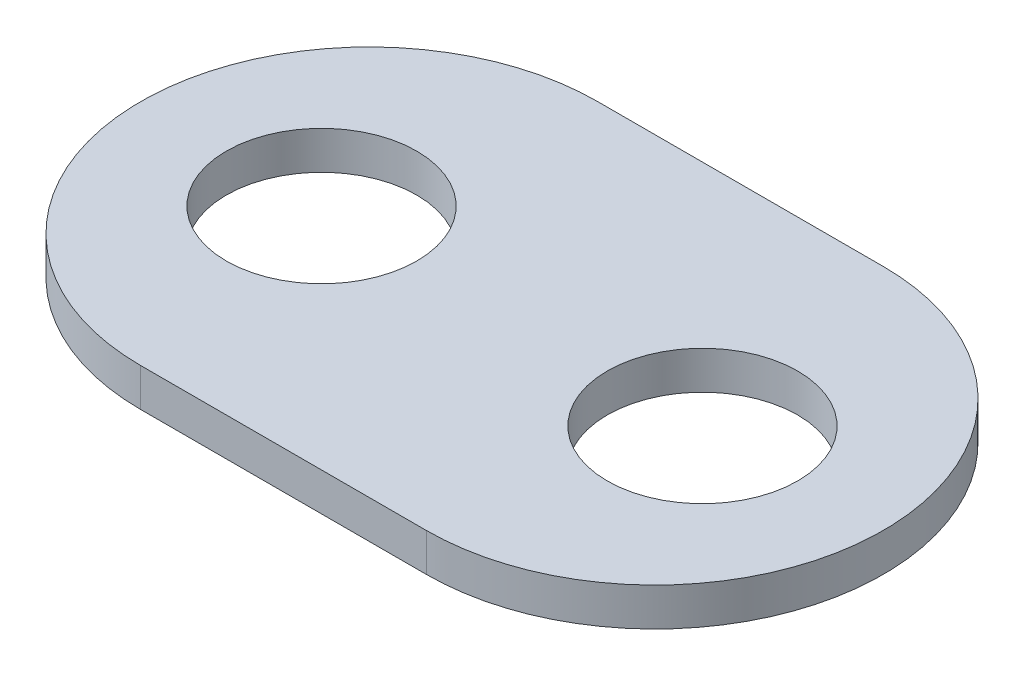
ISO-10303-21;
HEADER;
FILE_DESCRIPTION(('STEP AP214'),'2;1');
FILE_NAME('part.step','',(''),(''),'','','');
FILE_SCHEMA(('AUTOMOTIVE_DESIGN { 1 0 10303 214 1 1 1 1 }'));
ENDSEC;
DATA;
#1=APPLICATION_CONTEXT('core data for automotive mechanical design processes');
#2=APPLICATION_PROTOCOL_DEFINITION('international standard','automotive_design',2000,#1);
#3=PRODUCT_CONTEXT('',#1,'mechanical');
#4=PRODUCT('Part','Part','',(#3));
#5=PRODUCT_RELATED_PRODUCT_CATEGORY('part','',(#4));
#6=PRODUCT_DEFINITION_FORMATION('','',#4);
#7=PRODUCT_DEFINITION_CONTEXT('part definition',#1,'design');
#8=PRODUCT_DEFINITION('design','',#6,#7);
#9=PRODUCT_DEFINITION_SHAPE('','',#8);
#10=(LENGTH_UNIT() NAMED_UNIT(*) SI_UNIT(.MILLI.,.METRE.));
#11=(NAMED_UNIT(*) PLANE_ANGLE_UNIT() SI_UNIT($,.RADIAN.));
#12=(NAMED_UNIT(*) SI_UNIT($,.STERADIAN.) SOLID_ANGLE_UNIT());
#13=UNCERTAINTY_MEASURE_WITH_UNIT(LENGTH_MEASURE(1.E-05),#10,'distance_accuracy_value','');
#14=(GEOMETRIC_REPRESENTATION_CONTEXT(3) GLOBAL_UNCERTAINTY_ASSIGNED_CONTEXT((#13)) GLOBAL_UNIT_ASSIGNED_CONTEXT((#10,
#11,#12)) REPRESENTATION_CONTEXT('',''));
#15=CARTESIAN_POINT('',(0.,0.,0.));
#16=DIRECTION('',(0.,0.,1.));
#17=DIRECTION('',(1.,0.,0.));
#18=AXIS2_PLACEMENT_3D('',#15,#16,#17);
#19=CARTESIAN_POINT('',(7.5,2.,0.));
#20=DIRECTION('',(0.,-1.,0.));
#21=DIRECTION('',(0.,0.,-1.));
#22=AXIS2_PLACEMENT_3D('',#19,#20,#21);
#23=CYLINDRICAL_SURFACE('',#22,12.);
#24=CARTESIAN_POINT('',(7.5,0.,0.));
#25=DIRECTION('',(0.,1.,0.));
#26=DIRECTION('',(0.,0.,1.));
#27=AXIS2_PLACEMENT_3D('',#24,#25,#26);
#28=CIRCLE('',#27,12.);
#29=CARTESIAN_POINT('',(7.5,0.,-12.));
#30=VERTEX_POINT('',#29);
#31=CARTESIAN_POINT('',(7.5,0.,12.));
#32=VERTEX_POINT('',#31);
#33=EDGE_CURVE('E111',#30,#32,#28,.F.);
#34=ORIENTED_EDGE('',*,*,#33,.F.);
#35=DIRECTION('',(0.,-1.,0.));
#36=VECTOR('',#35,1.);
#37=CARTESIAN_POINT('',(7.5,2.,-12.));
#38=LINE('',#37,#36);
#39=CARTESIAN_POINT('',(7.5,2.,-12.));
#40=VERTEX_POINT('',#39);
#41=EDGE_CURVE('E11',#40,#30,#38,.T.);
#42=ORIENTED_EDGE('',*,*,#41,.F.);
#43=CARTESIAN_POINT('',(7.5,2.,0.));
#44=DIRECTION('',(0.,1.,0.));
#45=DIRECTION('',(0.,0.,1.));
#46=AXIS2_PLACEMENT_3D('',#43,#44,#45);
#47=CIRCLE('',#46,12.);
#48=CARTESIAN_POINT('',(7.5,2.,12.));
#49=VERTEX_POINT('',#48);
#50=EDGE_CURVE('E98',#40,#49,#47,.F.);
#51=ORIENTED_EDGE('',*,*,#50,.T.);
#52=DIRECTION('',(0.,-1.,0.));
#53=VECTOR('',#52,1.);
#54=CARTESIAN_POINT('',(7.5,2.,12.));
#55=LINE('',#54,#53);
#56=EDGE_CURVE('E76',#49,#32,#55,.T.);
#57=ORIENTED_EDGE('',*,*,#56,.T.);
#58=EDGE_LOOP('',(#34,#42,#51,#57));
#59=FACE_BOUND('',#58,.T.);
#60=ADVANCED_FACE('F36',(#59),#23,.T.);
#61=CARTESIAN_POINT('',(0.,2.,-12.));
#62=DIRECTION('',(0.,0.,-1.));
#63=DIRECTION('',(-1.,0.,0.));
#64=AXIS2_PLACEMENT_3D('',#61,#62,#63);
#65=PLANE('',#64);
#66=DIRECTION('',(1.,0.,0.));
#67=VECTOR('',#66,1.);
#68=CARTESIAN_POINT('',(0.,0.,-12.));
#69=LINE('',#68,#67);
#70=CARTESIAN_POINT('',(-7.5,0.,-12.));
#71=VERTEX_POINT('',#70);
#72=EDGE_CURVE('E88',#71,#30,#69,.T.);
#73=ORIENTED_EDGE('',*,*,#72,.F.);
#74=DIRECTION('',(0.,-1.,0.));
#75=VECTOR('',#74,1.);
#76=CARTESIAN_POINT('',(-7.5,2.,-12.));
#77=LINE('',#76,#75);
#78=CARTESIAN_POINT('',(-7.5,2.,-12.));
#79=VERTEX_POINT('',#78);
#80=EDGE_CURVE('E45',#79,#71,#77,.T.);
#81=ORIENTED_EDGE('',*,*,#80,.F.);
#82=DIRECTION('',(1.,0.,0.));
#83=VECTOR('',#82,1.);
#84=CARTESIAN_POINT('',(0.,2.,-12.));
#85=LINE('',#84,#83);
#86=EDGE_CURVE('E86',#79,#40,#85,.T.);
#87=ORIENTED_EDGE('',*,*,#86,.T.);
#88=ORIENTED_EDGE('',*,*,#41,.T.);
#89=EDGE_LOOP('',(#73,#81,#87,#88));
#90=FACE_BOUND('',#89,.T.);
#91=ADVANCED_FACE('F84',(#90),#65,.T.);
#92=CARTESIAN_POINT('',(-7.5,2.,0.));
#93=DIRECTION('',(0.,-1.,0.));
#94=DIRECTION('',(0.,0.,-1.));
#95=AXIS2_PLACEMENT_3D('',#92,#93,#94);
#96=CYLINDRICAL_SURFACE('',#95,12.);
#97=CARTESIAN_POINT('',(-7.5,0.,0.));
#98=DIRECTION('',(0.,1.,0.));
#99=DIRECTION('',(0.,0.,1.));
#100=AXIS2_PLACEMENT_3D('',#97,#98,#99);
#101=CIRCLE('',#100,12.);
#102=CARTESIAN_POINT('',(-7.5,0.,12.));
#103=VERTEX_POINT('',#102);
#104=EDGE_CURVE('E114',#71,#103,#101,.T.);
#105=ORIENTED_EDGE('',*,*,#104,.T.);
#106=DIRECTION('',(0.,-1.,0.));
#107=VECTOR('',#106,1.);
#108=CARTESIAN_POINT('',(-7.5,2.,12.));
#109=LINE('',#108,#107);
#110=CARTESIAN_POINT('',(-7.5,2.,12.));
#111=VERTEX_POINT('',#110);
#112=EDGE_CURVE('E91',#111,#103,#109,.T.);
#113=ORIENTED_EDGE('',*,*,#112,.F.);
#114=CARTESIAN_POINT('',(-7.5,2.,0.));
#115=DIRECTION('',(0.,1.,0.));
#116=DIRECTION('',(0.,0.,1.));
#117=AXIS2_PLACEMENT_3D('',#114,#115,#116);
#118=CIRCLE('',#117,12.);
#119=EDGE_CURVE('E93',#79,#111,#118,.T.);
#120=ORIENTED_EDGE('',*,*,#119,.F.);
#121=ORIENTED_EDGE('',*,*,#80,.T.);
#122=EDGE_LOOP('',(#105,#113,#120,#121));
#123=FACE_BOUND('',#122,.T.);
#124=ADVANCED_FACE('F94',(#123),#96,.T.);
#125=CARTESIAN_POINT('',(0.,2.,12.));
#126=DIRECTION('',(0.,0.,-1.));
#127=DIRECTION('',(-1.,0.,0.));
#128=AXIS2_PLACEMENT_3D('',#125,#126,#127);
#129=PLANE('',#128);
#130=DIRECTION('',(1.,0.,0.));
#131=VECTOR('',#130,1.);
#132=CARTESIAN_POINT('',(0.,0.,12.));
#133=LINE('',#132,#131);
#134=EDGE_CURVE('E69',#103,#32,#133,.T.);
#135=ORIENTED_EDGE('',*,*,#134,.T.);
#136=ORIENTED_EDGE('',*,*,#56,.F.);
#137=DIRECTION('',(1.,0.,0.));
#138=VECTOR('',#137,1.);
#139=CARTESIAN_POINT('',(0.,2.,12.));
#140=LINE('',#139,#138);
#141=EDGE_CURVE('E53',#111,#49,#140,.T.);
#142=ORIENTED_EDGE('',*,*,#141,.F.);
#143=ORIENTED_EDGE('',*,*,#112,.T.);
#144=EDGE_LOOP('',(#135,#136,#142,#143));
#145=FACE_BOUND('',#144,.T.);
#146=ADVANCED_FACE('F122',(#145),#129,.F.);
#147=CARTESIAN_POINT('',(10.,2.,0.));
#148=DIRECTION('',(0.,-1.,0.));
#149=DIRECTION('',(0.,0.,-1.));
#150=AXIS2_PLACEMENT_3D('',#147,#148,#149);
#151=CYLINDRICAL_SURFACE('',#150,5.);
#152=CARTESIAN_POINT('',(10.,2.,0.));
#153=DIRECTION('',(0.,1.,0.));
#154=DIRECTION('',(0.,0.,1.));
#155=AXIS2_PLACEMENT_3D('',#152,#153,#154);
#156=CIRCLE('',#155,5.);
#157=CARTESIAN_POINT('',(10.,2.,4.99999999999999));
#158=VERTEX_POINT('',#157);
#159=EDGE_CURVE('E100',#158,#158,#156,.T.);
#160=ORIENTED_EDGE('',*,*,#159,.T.);
#161=EDGE_LOOP('',(#160));
#162=FACE_BOUND('',#161,.T.);
#163=CARTESIAN_POINT('',(10.,0.,0.));
#164=DIRECTION('',(0.,1.,0.));
#165=DIRECTION('',(0.,0.,1.));
#166=AXIS2_PLACEMENT_3D('',#163,#164,#165);
#167=CIRCLE('',#166,5.);
#168=CARTESIAN_POINT('',(10.,0.,4.99999999999999));
#169=VERTEX_POINT('',#168);
#170=EDGE_CURVE('E108',#169,#169,#167,.T.);
#171=ORIENTED_EDGE('',*,*,#170,.F.);
#172=EDGE_LOOP('',(#171));
#173=FACE_BOUND('',#172,.T.);
#174=ADVANCED_FACE('F38',(#162,#173),#151,.F.);
#175=CARTESIAN_POINT('',(-10.,2.,0.));
#176=DIRECTION('',(0.,-1.,0.));
#177=DIRECTION('',(0.,0.,-1.));
#178=AXIS2_PLACEMENT_3D('',#175,#176,#177);
#179=CYLINDRICAL_SURFACE('',#178,5.);
#180=CARTESIAN_POINT('',(-10.,2.,0.));
#181=DIRECTION('',(0.,1.,0.));
#182=DIRECTION('',(0.,0.,1.));
#183=AXIS2_PLACEMENT_3D('',#180,#181,#182);
#184=CIRCLE('',#183,5.);
#185=CARTESIAN_POINT('',(-10.,2.,5.));
#186=VERTEX_POINT('',#185);
#187=EDGE_CURVE('E105',#186,#186,#184,.T.);
#188=ORIENTED_EDGE('',*,*,#187,.T.);
#189=EDGE_LOOP('',(#188));
#190=FACE_BOUND('',#189,.T.);
#191=CARTESIAN_POINT('',(-10.,0.,0.));
#192=DIRECTION('',(0.,1.,0.));
#193=DIRECTION('',(0.,0.,1.));
#194=AXIS2_PLACEMENT_3D('',#191,#192,#193);
#195=CIRCLE('',#194,5.);
#196=CARTESIAN_POINT('',(-10.,0.,5.));
#197=VERTEX_POINT('',#196);
#198=EDGE_CURVE('E117',#197,#197,#195,.T.);
#199=ORIENTED_EDGE('',*,*,#198,.F.);
#200=EDGE_LOOP('',(#199));
#201=FACE_BOUND('',#200,.T.);
#202=ADVANCED_FACE('F135',(#190,#201),#179,.F.);
#203=CARTESIAN_POINT('',(0.,2.,0.));
#204=DIRECTION('',(0.,1.,0.));
#205=DIRECTION('',(0.,0.,1.));
#206=AXIS2_PLACEMENT_3D('',#203,#204,#205);
#207=PLANE('',#206);
#208=ORIENTED_EDGE('',*,*,#159,.F.);
#209=EDGE_LOOP('',(#208));
#210=FACE_BOUND('',#209,.T.);
#211=ORIENTED_EDGE('',*,*,#50,.F.);
#212=ORIENTED_EDGE('',*,*,#86,.F.);
#213=ORIENTED_EDGE('',*,*,#119,.T.);
#214=ORIENTED_EDGE('',*,*,#141,.T.);
#215=EDGE_LOOP('',(#211,#212,#213,#214));
#216=FACE_BOUND('',#215,.T.);
#217=ORIENTED_EDGE('',*,*,#187,.F.);
#218=EDGE_LOOP('',(#217));
#219=FACE_BOUND('',#218,.T.);
#220=ADVANCED_FACE('F96',(#210,#216,#219),#207,.T.);
#221=CARTESIAN_POINT('',(0.,0.,0.));
#222=DIRECTION('',(0.,1.,0.));
#223=DIRECTION('',(0.,0.,1.));
#224=AXIS2_PLACEMENT_3D('',#221,#222,#223);
#225=PLANE('',#224);
#226=ORIENTED_EDGE('',*,*,#170,.T.);
#227=EDGE_LOOP('',(#226));
#228=FACE_BOUND('',#227,.T.);
#229=ORIENTED_EDGE('',*,*,#33,.T.);
#230=ORIENTED_EDGE('',*,*,#134,.F.);
#231=ORIENTED_EDGE('',*,*,#104,.F.);
#232=ORIENTED_EDGE('',*,*,#72,.T.);
#233=EDGE_LOOP('',(#229,#230,#231,#232));
#234=FACE_BOUND('',#233,.T.);
#235=ORIENTED_EDGE('',*,*,#198,.T.);
#236=EDGE_LOOP('',(#235));
#237=FACE_BOUND('',#236,.T.);
#238=ADVANCED_FACE('F123',(#228,#234,#237),#225,.F.);
#239=CLOSED_SHELL('',(#60,#91,#124,#146,#174,#202,#220,#238));
#240=MANIFOLD_SOLID_BREP('B2',#239);
#241=ADVANCED_BREP_SHAPE_REPRESENTATION('',(#18,#240),#14);
#242=SHAPE_DEFINITION_REPRESENTATION(#9,#241);
ENDSEC;
END-ISO-10303-21;
